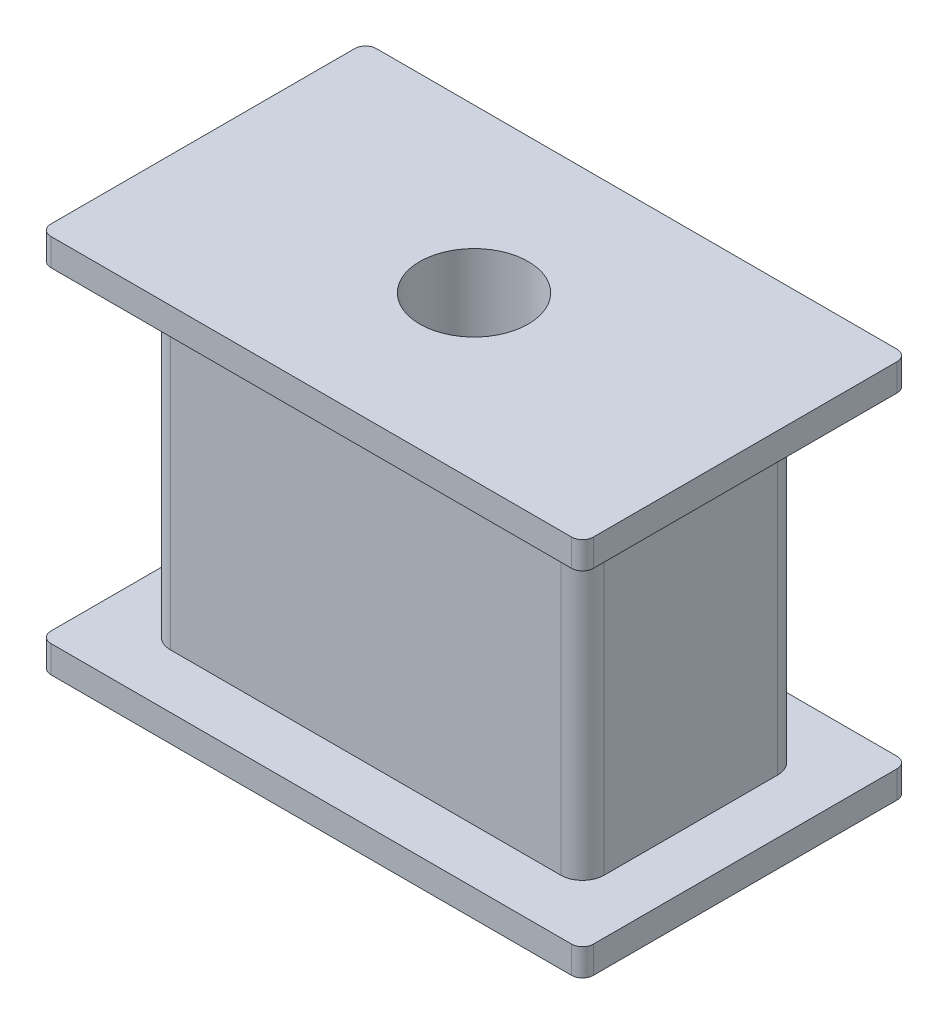
ISO-10303-21;
HEADER;
FILE_DESCRIPTION(('STEP AP214'),'2;1');
FILE_NAME('part.step','',(''),(''),'','','');
FILE_SCHEMA(('AUTOMOTIVE_DESIGN { 1 0 10303 214 1 1 1 1 }'));
ENDSEC;
DATA;
#1=APPLICATION_CONTEXT('core data for automotive mechanical design processes');
#2=APPLICATION_PROTOCOL_DEFINITION('international standard','automotive_design',2000,#1);
#3=PRODUCT_CONTEXT('',#1,'mechanical');
#4=PRODUCT('Part','Part','',(#3));
#5=PRODUCT_RELATED_PRODUCT_CATEGORY('part','',(#4));
#6=PRODUCT_DEFINITION_FORMATION('','',#4);
#7=PRODUCT_DEFINITION_CONTEXT('part definition',#1,'design');
#8=PRODUCT_DEFINITION('design','',#6,#7);
#9=PRODUCT_DEFINITION_SHAPE('','',#8);
#10=(LENGTH_UNIT() NAMED_UNIT(*) SI_UNIT(.MILLI.,.METRE.));
#11=(NAMED_UNIT(*) PLANE_ANGLE_UNIT() SI_UNIT($,.RADIAN.));
#12=(NAMED_UNIT(*) SI_UNIT($,.STERADIAN.) SOLID_ANGLE_UNIT());
#13=UNCERTAINTY_MEASURE_WITH_UNIT(LENGTH_MEASURE(1.E-05),#10,'distance_accuracy_value','');
#14=(GEOMETRIC_REPRESENTATION_CONTEXT(3) GLOBAL_UNCERTAINTY_ASSIGNED_CONTEXT((#13)) GLOBAL_UNIT_ASSIGNED_CONTEXT((#10,
#11,#12)) REPRESENTATION_CONTEXT('',''));
#15=CARTESIAN_POINT('',(0.,0.,0.));
#16=DIRECTION('',(0.,0.,1.));
#17=DIRECTION('',(1.,0.,0.));
#18=AXIS2_PLACEMENT_3D('',#15,#16,#17);
#19=CARTESIAN_POINT('',(20.,30.,10.));
#20=DIRECTION('',(-1.,0.,0.));
#21=DIRECTION('',(0.,0.,1.));
#22=AXIS2_PLACEMENT_3D('',#19,#20,#21);
#23=PLANE('',#22);
#24=DIRECTION('',(0.,0.,-1.));
#25=VECTOR('',#24,1.);
#26=CARTESIAN_POINT('',(20.,30.,10.));
#27=LINE('',#26,#25);
#28=CARTESIAN_POINT('',(20.,30.,8.));
#29=VERTEX_POINT('',#28);
#30=CARTESIAN_POINT('',(20.,30.,-8.));
#31=VERTEX_POINT('',#30);
#32=EDGE_CURVE('E248',#29,#31,#27,.T.);
#33=ORIENTED_EDGE('',*,*,#32,.F.);
#34=DIRECTION('',(0.,-1.,0.));
#35=VECTOR('',#34,1.);
#36=CARTESIAN_POINT('',(20.,30.,8.));
#37=LINE('',#36,#35);
#38=CARTESIAN_POINT('',(20.,0.,8.));
#39=VERTEX_POINT('',#38);
#40=EDGE_CURVE('E231',#29,#39,#37,.T.);
#41=ORIENTED_EDGE('',*,*,#40,.T.);
#42=DIRECTION('',(0.,0.,-1.));
#43=VECTOR('',#42,1.);
#44=CARTESIAN_POINT('',(20.,0.,10.));
#45=LINE('',#44,#43);
#46=CARTESIAN_POINT('',(20.,0.,-8.));
#47=VERTEX_POINT('',#46);
#48=EDGE_CURVE('E377',#39,#47,#45,.T.);
#49=ORIENTED_EDGE('',*,*,#48,.T.);
#50=DIRECTION('',(0.,-1.,0.));
#51=VECTOR('',#50,1.);
#52=CARTESIAN_POINT('',(20.,30.,-8.));
#53=LINE('',#52,#51);
#54=EDGE_CURVE('E267',#47,#31,#53,.F.);
#55=ORIENTED_EDGE('',*,*,#54,.T.);
#56=EDGE_LOOP('',(#33,#41,#49,#55));
#57=FACE_BOUND('',#56,.T.);
#58=ADVANCED_FACE('F59',(#57),#23,.F.);
#59=CARTESIAN_POINT('',(-20.,30.,-10.));
#60=DIRECTION('',(0.,0.,1.));
#61=DIRECTION('',(1.,0.,0.));
#62=AXIS2_PLACEMENT_3D('',#59,#60,#61);
#63=PLANE('',#62);
#64=DIRECTION('',(-1.,0.,0.));
#65=VECTOR('',#64,1.);
#66=CARTESIAN_POINT('',(-20.,0.,-10.));
#67=LINE('',#66,#65);
#68=CARTESIAN_POINT('',(18.,0.,-10.));
#69=VERTEX_POINT('',#68);
#70=CARTESIAN_POINT('',(-18.,0.,-10.));
#71=VERTEX_POINT('',#70);
#72=EDGE_CURVE('E254',#69,#71,#67,.T.);
#73=ORIENTED_EDGE('',*,*,#72,.T.);
#74=DIRECTION('',(0.,-1.,0.));
#75=VECTOR('',#74,1.);
#76=CARTESIAN_POINT('',(-18.,30.,-10.));
#77=LINE('',#76,#75);
#78=CARTESIAN_POINT('',(-18.,30.,-10.));
#79=VERTEX_POINT('',#78);
#80=EDGE_CURVE('E265',#71,#79,#77,.F.);
#81=ORIENTED_EDGE('',*,*,#80,.T.);
#82=DIRECTION('',(-1.,0.,0.));
#83=VECTOR('',#82,1.);
#84=CARTESIAN_POINT('',(-20.,30.,-10.));
#85=LINE('',#84,#83);
#86=CARTESIAN_POINT('',(18.,30.,-10.));
#87=VERTEX_POINT('',#86);
#88=EDGE_CURVE('E252',#87,#79,#85,.T.);
#89=ORIENTED_EDGE('',*,*,#88,.F.);
#90=DIRECTION('',(0.,-1.,0.));
#91=VECTOR('',#90,1.);
#92=CARTESIAN_POINT('',(18.,30.,-10.));
#93=LINE('',#92,#91);
#94=EDGE_CURVE('E262',#87,#69,#93,.T.);
#95=ORIENTED_EDGE('',*,*,#94,.T.);
#96=EDGE_LOOP('',(#73,#81,#89,#95));
#97=FACE_BOUND('',#96,.T.);
#98=ADVANCED_FACE('F384',(#97),#63,.F.);
#99=CARTESIAN_POINT('',(-20.,30.,10.));
#100=DIRECTION('',(1.,0.,0.));
#101=DIRECTION('',(0.,0.,-1.));
#102=AXIS2_PLACEMENT_3D('',#99,#100,#101);
#103=PLANE('',#102);
#104=DIRECTION('',(0.,0.,1.));
#105=VECTOR('',#104,1.);
#106=CARTESIAN_POINT('',(-20.,0.,10.));
#107=LINE('',#106,#105);
#108=CARTESIAN_POINT('',(-20.,0.,-8.));
#109=VERTEX_POINT('',#108);
#110=CARTESIAN_POINT('',(-20.,0.,8.));
#111=VERTEX_POINT('',#110);
#112=EDGE_CURVE('E249',#109,#111,#107,.T.);
#113=ORIENTED_EDGE('',*,*,#112,.T.);
#114=DIRECTION('',(0.,-1.,0.));
#115=VECTOR('',#114,1.);
#116=CARTESIAN_POINT('',(-20.,30.,8.));
#117=LINE('',#116,#115);
#118=CARTESIAN_POINT('',(-20.,30.,8.));
#119=VERTEX_POINT('',#118);
#120=EDGE_CURVE('E225',#111,#119,#117,.F.);
#121=ORIENTED_EDGE('',*,*,#120,.T.);
#122=DIRECTION('',(0.,0.,1.));
#123=VECTOR('',#122,1.);
#124=CARTESIAN_POINT('',(-20.,30.,10.));
#125=LINE('',#124,#123);
#126=CARTESIAN_POINT('',(-20.,30.,-8.));
#127=VERTEX_POINT('',#126);
#128=EDGE_CURVE('E373',#127,#119,#125,.T.);
#129=ORIENTED_EDGE('',*,*,#128,.F.);
#130=DIRECTION('',(0.,-1.,0.));
#131=VECTOR('',#130,1.);
#132=CARTESIAN_POINT('',(-20.,30.,-8.));
#133=LINE('',#132,#131);
#134=EDGE_CURVE('E241',#127,#109,#133,.T.);
#135=ORIENTED_EDGE('',*,*,#134,.T.);
#136=EDGE_LOOP('',(#113,#121,#129,#135));
#137=FACE_BOUND('',#136,.T.);
#138=ADVANCED_FACE('F394',(#137),#103,.F.);
#139=CARTESIAN_POINT('',(-20.,30.,10.));
#140=DIRECTION('',(0.,0.,-1.));
#141=DIRECTION('',(-1.,0.,0.));
#142=AXIS2_PLACEMENT_3D('',#139,#140,#141);
#143=PLANE('',#142);
#144=DIRECTION('',(1.,0.,0.));
#145=VECTOR('',#144,1.);
#146=CARTESIAN_POINT('',(-20.,30.,10.));
#147=LINE('',#146,#145);
#148=CARTESIAN_POINT('',(-18.,30.,10.));
#149=VERTEX_POINT('',#148);
#150=CARTESIAN_POINT('',(18.,30.,10.));
#151=VERTEX_POINT('',#150);
#152=EDGE_CURVE('E240',#149,#151,#147,.T.);
#153=ORIENTED_EDGE('',*,*,#152,.F.);
#154=DIRECTION('',(0.,-1.,0.));
#155=VECTOR('',#154,1.);
#156=CARTESIAN_POINT('',(-18.,30.,10.));
#157=LINE('',#156,#155);
#158=CARTESIAN_POINT('',(-18.,0.,10.));
#159=VERTEX_POINT('',#158);
#160=EDGE_CURVE('E224',#149,#159,#157,.T.);
#161=ORIENTED_EDGE('',*,*,#160,.T.);
#162=DIRECTION('',(1.,0.,0.));
#163=VECTOR('',#162,1.);
#164=CARTESIAN_POINT('',(-20.,0.,10.));
#165=LINE('',#164,#163);
#166=CARTESIAN_POINT('',(18.,0.,10.));
#167=VERTEX_POINT('',#166);
#168=EDGE_CURVE('E237',#159,#167,#165,.T.);
#169=ORIENTED_EDGE('',*,*,#168,.T.);
#170=DIRECTION('',(0.,-1.,0.));
#171=VECTOR('',#170,1.);
#172=CARTESIAN_POINT('',(18.,30.,10.));
#173=LINE('',#172,#171);
#174=EDGE_CURVE('E242',#167,#151,#173,.F.);
#175=ORIENTED_EDGE('',*,*,#174,.T.);
#176=EDGE_LOOP('',(#153,#161,#169,#175));
#177=FACE_BOUND('',#176,.T.);
#178=ADVANCED_FACE('F236',(#177),#143,.F.);
#179=CARTESIAN_POINT('',(25.,32.5,15.));
#180=DIRECTION('',(-1.,0.,0.));
#181=DIRECTION('',(0.,0.,1.));
#182=AXIS2_PLACEMENT_3D('',#179,#180,#181);
#183=PLANE('',#182);
#184=DIRECTION('',(0.,0.,-1.));
#185=VECTOR('',#184,1.);
#186=CARTESIAN_POINT('',(25.,32.5,15.));
#187=LINE('',#186,#185);
#188=CARTESIAN_POINT('',(25.,32.5,14.));
#189=VERTEX_POINT('',#188);
#190=CARTESIAN_POINT('',(25.,32.5,-14.));
#191=VERTEX_POINT('',#190);
#192=EDGE_CURVE('E365',#189,#191,#187,.T.);
#193=ORIENTED_EDGE('',*,*,#192,.F.);
#194=DIRECTION('',(0.,-1.,0.));
#195=VECTOR('',#194,1.);
#196=CARTESIAN_POINT('',(25.,32.5,14.));
#197=LINE('',#196,#195);
#198=CARTESIAN_POINT('',(25.,30.,14.));
#199=VERTEX_POINT('',#198);
#200=EDGE_CURVE('E321',#189,#199,#197,.T.);
#201=ORIENTED_EDGE('',*,*,#200,.T.);
#202=DIRECTION('',(0.,0.,-1.));
#203=VECTOR('',#202,1.);
#204=CARTESIAN_POINT('',(25.,30.,15.));
#205=LINE('',#204,#203);
#206=CARTESIAN_POINT('',(25.,30.,-14.));
#207=VERTEX_POINT('',#206);
#208=EDGE_CURVE('E367',#199,#207,#205,.T.);
#209=ORIENTED_EDGE('',*,*,#208,.T.);
#210=DIRECTION('',(0.,-1.,0.));
#211=VECTOR('',#210,1.);
#212=CARTESIAN_POINT('',(25.,32.5,-14.));
#213=LINE('',#212,#211);
#214=EDGE_CURVE('E319',#207,#191,#213,.F.);
#215=ORIENTED_EDGE('',*,*,#214,.T.);
#216=EDGE_LOOP('',(#193,#201,#209,#215));
#217=FACE_BOUND('',#216,.T.);
#218=ADVANCED_FACE('F401',(#217),#183,.F.);
#219=CARTESIAN_POINT('',(-25.,32.5,-15.));
#220=DIRECTION('',(0.,0.,1.));
#221=DIRECTION('',(1.,0.,0.));
#222=AXIS2_PLACEMENT_3D('',#219,#220,#221);
#223=PLANE('',#222);
#224=DIRECTION('',(-1.,0.,0.));
#225=VECTOR('',#224,1.);
#226=CARTESIAN_POINT('',(-25.,32.5,-15.));
#227=LINE('',#226,#225);
#228=CARTESIAN_POINT('',(24.,32.5,-15.));
#229=VERTEX_POINT('',#228);
#230=CARTESIAN_POINT('',(-24.,32.5,-15.));
#231=VERTEX_POINT('',#230);
#232=EDGE_CURVE('E463',#229,#231,#227,.T.);
#233=ORIENTED_EDGE('',*,*,#232,.F.);
#234=DIRECTION('',(0.,-1.,0.));
#235=VECTOR('',#234,1.);
#236=CARTESIAN_POINT('',(24.,32.5,-15.));
#237=LINE('',#236,#235);
#238=CARTESIAN_POINT('',(24.,30.,-15.));
#239=VERTEX_POINT('',#238);
#240=EDGE_CURVE('E346',#229,#239,#237,.T.);
#241=ORIENTED_EDGE('',*,*,#240,.T.);
#242=DIRECTION('',(-1.,0.,0.));
#243=VECTOR('',#242,1.);
#244=CARTESIAN_POINT('',(-25.,30.,-15.));
#245=LINE('',#244,#243);
#246=CARTESIAN_POINT('',(-24.,30.,-15.));
#247=VERTEX_POINT('',#246);
#248=EDGE_CURVE('E362',#239,#247,#245,.T.);
#249=ORIENTED_EDGE('',*,*,#248,.T.);
#250=DIRECTION('',(0.,-1.,0.));
#251=VECTOR('',#250,1.);
#252=CARTESIAN_POINT('',(-24.,32.5,-15.));
#253=LINE('',#252,#251);
#254=EDGE_CURVE('E344',#247,#231,#253,.F.);
#255=ORIENTED_EDGE('',*,*,#254,.T.);
#256=EDGE_LOOP('',(#233,#241,#249,#255));
#257=FACE_BOUND('',#256,.T.);
#258=ADVANCED_FACE('F501',(#257),#223,.F.);
#259=CARTESIAN_POINT('',(-25.,32.5,15.));
#260=DIRECTION('',(1.,0.,0.));
#261=DIRECTION('',(0.,0.,-1.));
#262=AXIS2_PLACEMENT_3D('',#259,#260,#261);
#263=PLANE('',#262);
#264=DIRECTION('',(0.,0.,1.));
#265=VECTOR('',#264,1.);
#266=CARTESIAN_POINT('',(-25.,30.,15.));
#267=LINE('',#266,#265);
#268=CARTESIAN_POINT('',(-25.,30.,-14.));
#269=VERTEX_POINT('',#268);
#270=CARTESIAN_POINT('',(-25.,30.,14.));
#271=VERTEX_POINT('',#270);
#272=EDGE_CURVE('E352',#269,#271,#267,.T.);
#273=ORIENTED_EDGE('',*,*,#272,.T.);
#274=DIRECTION('',(0.,-1.,0.));
#275=VECTOR('',#274,1.);
#276=CARTESIAN_POINT('',(-25.,32.5,14.));
#277=LINE('',#276,#275);
#278=CARTESIAN_POINT('',(-25.,32.5,14.));
#279=VERTEX_POINT('',#278);
#280=EDGE_CURVE('E12',#271,#279,#277,.F.);
#281=ORIENTED_EDGE('',*,*,#280,.T.);
#282=DIRECTION('',(0.,0.,1.));
#283=VECTOR('',#282,1.);
#284=CARTESIAN_POINT('',(-25.,32.5,15.));
#285=LINE('',#284,#283);
#286=CARTESIAN_POINT('',(-25.,32.5,-14.));
#287=VERTEX_POINT('',#286);
#288=EDGE_CURVE('E353',#287,#279,#285,.T.);
#289=ORIENTED_EDGE('',*,*,#288,.F.);
#290=DIRECTION('',(0.,-1.,0.));
#291=VECTOR('',#290,1.);
#292=CARTESIAN_POINT('',(-25.,32.5,-14.));
#293=LINE('',#292,#291);
#294=EDGE_CURVE('E67',#287,#269,#293,.T.);
#295=ORIENTED_EDGE('',*,*,#294,.T.);
#296=EDGE_LOOP('',(#273,#281,#289,#295));
#297=FACE_BOUND('',#296,.T.);
#298=ADVANCED_FACE('F351',(#297),#263,.F.);
#299=CARTESIAN_POINT('',(-25.,32.5,15.));
#300=DIRECTION('',(0.,0.,-1.));
#301=DIRECTION('',(-1.,0.,0.));
#302=AXIS2_PLACEMENT_3D('',#299,#300,#301);
#303=PLANE('',#302);
#304=DIRECTION('',(1.,0.,0.));
#305=VECTOR('',#304,1.);
#306=CARTESIAN_POINT('',(-25.,30.,15.));
#307=LINE('',#306,#305);
#308=CARTESIAN_POINT('',(-24.,30.,15.));
#309=VERTEX_POINT('',#308);
#310=CARTESIAN_POINT('',(24.,30.,15.));
#311=VERTEX_POINT('',#310);
#312=EDGE_CURVE('E361',#309,#311,#307,.T.);
#313=ORIENTED_EDGE('',*,*,#312,.T.);
#314=DIRECTION('',(0.,-1.,0.));
#315=VECTOR('',#314,1.);
#316=CARTESIAN_POINT('',(24.,32.5,15.));
#317=LINE('',#316,#315);
#318=CARTESIAN_POINT('',(24.,32.5,15.));
#319=VERTEX_POINT('',#318);
#320=EDGE_CURVE('E335',#311,#319,#317,.F.);
#321=ORIENTED_EDGE('',*,*,#320,.T.);
#322=DIRECTION('',(1.,0.,0.));
#323=VECTOR('',#322,1.);
#324=CARTESIAN_POINT('',(-25.,32.5,15.));
#325=LINE('',#324,#323);
#326=CARTESIAN_POINT('',(-24.,32.5,15.));
#327=VERTEX_POINT('',#326);
#328=EDGE_CURVE('E379',#327,#319,#325,.T.);
#329=ORIENTED_EDGE('',*,*,#328,.F.);
#330=DIRECTION('',(0.,-1.,0.));
#331=VECTOR('',#330,1.);
#332=CARTESIAN_POINT('',(-24.,32.5,15.));
#333=LINE('',#332,#331);
#334=EDGE_CURVE('E332',#327,#309,#333,.T.);
#335=ORIENTED_EDGE('',*,*,#334,.T.);
#336=EDGE_LOOP('',(#313,#321,#329,#335));
#337=FACE_BOUND('',#336,.T.);
#338=ADVANCED_FACE('F460',(#337),#303,.F.);
#339=CARTESIAN_POINT('',(0.,32.5,0.));
#340=DIRECTION('',(0.,-1.,0.));
#341=DIRECTION('',(0.,0.,-1.));
#342=AXIS2_PLACEMENT_3D('',#339,#340,#341);
#343=PLANE('',#342);
#344=CARTESIAN_POINT('',(0.,32.5,0.));
#345=DIRECTION('',(0.,1.,0.));
#346=DIRECTION('',(0.,0.,1.));
#347=AXIS2_PLACEMENT_3D('',#344,#345,#346);
#348=CIRCLE('',#347,5.);
#349=CARTESIAN_POINT('',(0.,32.5,5.));
#350=VERTEX_POINT('',#349);
#351=EDGE_CURVE('E550',#350,#350,#348,.T.);
#352=ORIENTED_EDGE('',*,*,#351,.F.);
#353=EDGE_LOOP('',(#352));
#354=FACE_BOUND('',#353,.T.);
#355=ORIENTED_EDGE('',*,*,#328,.T.);
#356=CARTESIAN_POINT('',(24.,32.5,14.));
#357=DIRECTION('',(0.,-1.,0.));
#358=DIRECTION('',(0.,0.,-1.));
#359=AXIS2_PLACEMENT_3D('',#356,#357,#358);
#360=CIRCLE('',#359,1.);
#361=EDGE_CURVE('E342',#319,#189,#360,.F.);
#362=ORIENTED_EDGE('',*,*,#361,.T.);
#363=ORIENTED_EDGE('',*,*,#192,.T.);
#364=CARTESIAN_POINT('',(24.,32.5,-14.));
#365=DIRECTION('',(0.,-1.,0.));
#366=DIRECTION('',(0.,0.,-1.));
#367=AXIS2_PLACEMENT_3D('',#364,#365,#366);
#368=CIRCLE('',#367,1.);
#369=EDGE_CURVE('E340',#191,#229,#368,.F.);
#370=ORIENTED_EDGE('',*,*,#369,.T.);
#371=ORIENTED_EDGE('',*,*,#232,.T.);
#372=CARTESIAN_POINT('',(-24.,32.5,-14.));
#373=DIRECTION('',(0.,-1.,0.));
#374=DIRECTION('',(0.,0.,-1.));
#375=AXIS2_PLACEMENT_3D('',#372,#373,#374);
#376=CIRCLE('',#375,1.);
#377=EDGE_CURVE('E79',#231,#287,#376,.F.);
#378=ORIENTED_EDGE('',*,*,#377,.T.);
#379=ORIENTED_EDGE('',*,*,#288,.T.);
#380=CARTESIAN_POINT('',(-24.,32.5,14.));
#381=DIRECTION('',(0.,-1.,0.));
#382=DIRECTION('',(0.,0.,-1.));
#383=AXIS2_PLACEMENT_3D('',#380,#381,#382);
#384=CIRCLE('',#383,1.);
#385=EDGE_CURVE('E338',#279,#327,#384,.F.);
#386=ORIENTED_EDGE('',*,*,#385,.T.);
#387=EDGE_LOOP('',(#355,#362,#363,#370,#371,#378,#379,#386));
#388=FACE_BOUND('',#387,.T.);
#389=ADVANCED_FACE('F457',(#354,#388),#343,.F.);
#390=CARTESIAN_POINT('',(0.,30.,0.));
#391=DIRECTION('',(0.,-1.,0.));
#392=DIRECTION('',(0.,0.,-1.));
#393=AXIS2_PLACEMENT_3D('',#390,#391,#392);
#394=PLANE('',#393);
#395=ORIENTED_EDGE('',*,*,#128,.T.);
#396=CARTESIAN_POINT('',(-18.,30.,8.));
#397=DIRECTION('',(0.,-1.,0.));
#398=DIRECTION('',(0.,0.,-1.));
#399=AXIS2_PLACEMENT_3D('',#396,#397,#398);
#400=CIRCLE('',#399,2.);
#401=EDGE_CURVE('E230',#119,#149,#400,.F.);
#402=ORIENTED_EDGE('',*,*,#401,.T.);
#403=ORIENTED_EDGE('',*,*,#152,.T.);
#404=CARTESIAN_POINT('',(18.,30.,8.));
#405=DIRECTION('',(0.,-1.,0.));
#406=DIRECTION('',(0.,0.,-1.));
#407=AXIS2_PLACEMENT_3D('',#404,#405,#406);
#408=CIRCLE('',#407,2.);
#409=EDGE_CURVE('E277',#151,#29,#408,.F.);
#410=ORIENTED_EDGE('',*,*,#409,.T.);
#411=ORIENTED_EDGE('',*,*,#32,.T.);
#412=CARTESIAN_POINT('',(18.,30.,-8.));
#413=DIRECTION('',(0.,-1.,0.));
#414=DIRECTION('',(0.,0.,-1.));
#415=AXIS2_PLACEMENT_3D('',#412,#413,#414);
#416=CIRCLE('',#415,2.);
#417=EDGE_CURVE('E281',#31,#87,#416,.F.);
#418=ORIENTED_EDGE('',*,*,#417,.T.);
#419=ORIENTED_EDGE('',*,*,#88,.T.);
#420=CARTESIAN_POINT('',(-18.,30.,-8.));
#421=DIRECTION('',(0.,-1.,0.));
#422=DIRECTION('',(0.,0.,-1.));
#423=AXIS2_PLACEMENT_3D('',#420,#421,#422);
#424=CIRCLE('',#423,2.);
#425=EDGE_CURVE('E274',#79,#127,#424,.F.);
#426=ORIENTED_EDGE('',*,*,#425,.T.);
#427=EDGE_LOOP('',(#395,#402,#403,#410,#411,#418,#419,#426));
#428=FACE_BOUND('',#427,.T.);
#429=ORIENTED_EDGE('',*,*,#208,.F.);
#430=CARTESIAN_POINT('',(24.,30.,14.));
#431=DIRECTION('',(0.,-1.,0.));
#432=DIRECTION('',(0.,0.,-1.));
#433=AXIS2_PLACEMENT_3D('',#430,#431,#432);
#434=CIRCLE('',#433,1.);
#435=EDGE_CURVE('E330',#199,#311,#434,.T.);
#436=ORIENTED_EDGE('',*,*,#435,.T.);
#437=ORIENTED_EDGE('',*,*,#312,.F.);
#438=CARTESIAN_POINT('',(-24.,30.,14.));
#439=DIRECTION('',(0.,-1.,0.));
#440=DIRECTION('',(0.,0.,-1.));
#441=AXIS2_PLACEMENT_3D('',#438,#439,#440);
#442=CIRCLE('',#441,1.);
#443=EDGE_CURVE('E326',#309,#271,#442,.T.);
#444=ORIENTED_EDGE('',*,*,#443,.T.);
#445=ORIENTED_EDGE('',*,*,#272,.F.);
#446=CARTESIAN_POINT('',(-24.,30.,-14.));
#447=DIRECTION('',(0.,-1.,0.));
#448=DIRECTION('',(0.,0.,-1.));
#449=AXIS2_PLACEMENT_3D('',#446,#447,#448);
#450=CIRCLE('',#449,1.);
#451=EDGE_CURVE('E324',#269,#247,#450,.T.);
#452=ORIENTED_EDGE('',*,*,#451,.T.);
#453=ORIENTED_EDGE('',*,*,#248,.F.);
#454=CARTESIAN_POINT('',(24.,30.,-14.));
#455=DIRECTION('',(0.,-1.,0.));
#456=DIRECTION('',(0.,0.,-1.));
#457=AXIS2_PLACEMENT_3D('',#454,#455,#456);
#458=CIRCLE('',#457,1.);
#459=EDGE_CURVE('E328',#239,#207,#458,.T.);
#460=ORIENTED_EDGE('',*,*,#459,.T.);
#461=EDGE_LOOP('',(#429,#436,#437,#444,#445,#452,#453,#460));
#462=FACE_BOUND('',#461,.T.);
#463=ADVANCED_FACE('F357',(#428,#462),#394,.T.);
#464=CARTESIAN_POINT('',(0.,-2.5,15.));
#465=DIRECTION('',(0.,0.,1.));
#466=DIRECTION('',(1.,0.,0.));
#467=AXIS2_PLACEMENT_3D('',#464,#465,#466);
#468=PLANE('',#467);
#469=DIRECTION('',(1.,0.,0.));
#470=VECTOR('',#469,1.);
#471=CARTESIAN_POINT('',(0.,-2.5,15.));
#472=LINE('',#471,#470);
#473=CARTESIAN_POINT('',(-24.,-2.5,15.));
#474=VERTEX_POINT('',#473);
#475=CARTESIAN_POINT('',(24.,-2.5,15.));
#476=VERTEX_POINT('',#475);
#477=EDGE_CURVE('E477',#474,#476,#472,.T.);
#478=ORIENTED_EDGE('',*,*,#477,.T.);
#479=DIRECTION('',(0.,1.,0.));
#480=VECTOR('',#479,1.);
#481=CARTESIAN_POINT('',(24.,-2.5,15.));
#482=LINE('',#481,#480);
#483=CARTESIAN_POINT('',(24.,0.,15.));
#484=VERTEX_POINT('',#483);
#485=EDGE_CURVE('E285',#476,#484,#482,.T.);
#486=ORIENTED_EDGE('',*,*,#485,.T.);
#487=DIRECTION('',(1.,0.,0.));
#488=VECTOR('',#487,1.);
#489=CARTESIAN_POINT('',(0.,0.,15.));
#490=LINE('',#489,#488);
#491=CARTESIAN_POINT('',(-24.,0.,15.));
#492=VERTEX_POINT('',#491);
#493=EDGE_CURVE('E484',#492,#484,#490,.T.);
#494=ORIENTED_EDGE('',*,*,#493,.F.);
#495=DIRECTION('',(0.,1.,0.));
#496=VECTOR('',#495,1.);
#497=CARTESIAN_POINT('',(-24.,-2.5,15.));
#498=LINE('',#497,#496);
#499=EDGE_CURVE('E283',#492,#474,#498,.F.);
#500=ORIENTED_EDGE('',*,*,#499,.T.);
#501=EDGE_LOOP('',(#478,#486,#494,#500));
#502=FACE_BOUND('',#501,.T.);
#503=ADVANCED_FACE('F517',(#502),#468,.T.);
#504=CARTESIAN_POINT('',(-25.,-2.5,0.));
#505=DIRECTION('',(-1.,0.,0.));
#506=DIRECTION('',(0.,0.,1.));
#507=AXIS2_PLACEMENT_3D('',#504,#505,#506);
#508=PLANE('',#507);
#509=DIRECTION('',(0.,0.,1.));
#510=VECTOR('',#509,1.);
#511=CARTESIAN_POINT('',(-25.,-2.5,0.));
#512=LINE('',#511,#510);
#513=CARTESIAN_POINT('',(-25.,-2.5,-14.));
#514=VERTEX_POINT('',#513);
#515=CARTESIAN_POINT('',(-25.,-2.5,14.));
#516=VERTEX_POINT('',#515);
#517=EDGE_CURVE('E471',#514,#516,#512,.T.);
#518=ORIENTED_EDGE('',*,*,#517,.T.);
#519=DIRECTION('',(0.,1.,0.));
#520=VECTOR('',#519,1.);
#521=CARTESIAN_POINT('',(-25.,-2.5,14.));
#522=LINE('',#521,#520);
#523=CARTESIAN_POINT('',(-25.,0.,14.));
#524=VERTEX_POINT('',#523);
#525=EDGE_CURVE('E311',#516,#524,#522,.T.);
#526=ORIENTED_EDGE('',*,*,#525,.T.);
#527=DIRECTION('',(0.,0.,1.));
#528=VECTOR('',#527,1.);
#529=CARTESIAN_POINT('',(-25.,0.,0.));
#530=LINE('',#529,#528);
#531=CARTESIAN_POINT('',(-25.,0.,-14.));
#532=VERTEX_POINT('',#531);
#533=EDGE_CURVE('E488',#532,#524,#530,.T.);
#534=ORIENTED_EDGE('',*,*,#533,.F.);
#535=DIRECTION('',(0.,1.,0.));
#536=VECTOR('',#535,1.);
#537=CARTESIAN_POINT('',(-25.,-2.5,-14.));
#538=LINE('',#537,#536);
#539=EDGE_CURVE('E309',#532,#514,#538,.F.);
#540=ORIENTED_EDGE('',*,*,#539,.T.);
#541=EDGE_LOOP('',(#518,#526,#534,#540));
#542=FACE_BOUND('',#541,.T.);
#543=ADVANCED_FACE('F528',(#542),#508,.T.);
#544=CARTESIAN_POINT('',(0.,-2.5,-15.));
#545=DIRECTION('',(0.,0.,-1.));
#546=DIRECTION('',(-1.,0.,0.));
#547=AXIS2_PLACEMENT_3D('',#544,#545,#546);
#548=PLANE('',#547);
#549=DIRECTION('',(-1.,0.,0.));
#550=VECTOR('',#549,1.);
#551=CARTESIAN_POINT('',(0.,-2.5,-15.));
#552=LINE('',#551,#550);
#553=CARTESIAN_POINT('',(24.,-2.5,-15.));
#554=VERTEX_POINT('',#553);
#555=CARTESIAN_POINT('',(-24.,-2.5,-15.));
#556=VERTEX_POINT('',#555);
#557=EDGE_CURVE('E467',#554,#556,#552,.T.);
#558=ORIENTED_EDGE('',*,*,#557,.T.);
#559=DIRECTION('',(0.,1.,0.));
#560=VECTOR('',#559,1.);
#561=CARTESIAN_POINT('',(-24.,-2.5,-15.));
#562=LINE('',#561,#560);
#563=CARTESIAN_POINT('',(-24.,0.,-15.));
#564=VERTEX_POINT('',#563);
#565=EDGE_CURVE('E316',#556,#564,#562,.T.);
#566=ORIENTED_EDGE('',*,*,#565,.T.);
#567=DIRECTION('',(-1.,0.,0.));
#568=VECTOR('',#567,1.);
#569=CARTESIAN_POINT('',(0.,0.,-15.));
#570=LINE('',#569,#568);
#571=CARTESIAN_POINT('',(24.,0.,-15.));
#572=VERTEX_POINT('',#571);
#573=EDGE_CURVE('E491',#572,#564,#570,.T.);
#574=ORIENTED_EDGE('',*,*,#573,.F.);
#575=DIRECTION('',(0.,1.,0.));
#576=VECTOR('',#575,1.);
#577=CARTESIAN_POINT('',(24.,-2.5,-15.));
#578=LINE('',#577,#576);
#579=EDGE_CURVE('E314',#572,#554,#578,.F.);
#580=ORIENTED_EDGE('',*,*,#579,.T.);
#581=EDGE_LOOP('',(#558,#566,#574,#580));
#582=FACE_BOUND('',#581,.T.);
#583=ADVANCED_FACE('F524',(#582),#548,.T.);
#584=CARTESIAN_POINT('',(25.,-2.5,0.));
#585=DIRECTION('',(1.,0.,0.));
#586=DIRECTION('',(0.,0.,-1.));
#587=AXIS2_PLACEMENT_3D('',#584,#585,#586);
#588=PLANE('',#587);
#589=DIRECTION('',(0.,0.,-1.));
#590=VECTOR('',#589,1.);
#591=CARTESIAN_POINT('',(25.,0.,0.));
#592=LINE('',#591,#590);
#593=CARTESIAN_POINT('',(25.,0.,14.));
#594=VERTEX_POINT('',#593);
#595=CARTESIAN_POINT('',(25.,0.,-14.));
#596=VERTEX_POINT('',#595);
#597=EDGE_CURVE('E481',#594,#596,#592,.T.);
#598=ORIENTED_EDGE('',*,*,#597,.F.);
#599=DIRECTION('',(0.,1.,0.));
#600=VECTOR('',#599,1.);
#601=CARTESIAN_POINT('',(25.,-2.5,14.));
#602=LINE('',#601,#600);
#603=CARTESIAN_POINT('',(25.,-2.5,14.));
#604=VERTEX_POINT('',#603);
#605=EDGE_CURVE('E299',#594,#604,#602,.F.);
#606=ORIENTED_EDGE('',*,*,#605,.T.);
#607=DIRECTION('',(0.,0.,-1.));
#608=VECTOR('',#607,1.);
#609=CARTESIAN_POINT('',(25.,-2.5,0.));
#610=LINE('',#609,#608);
#611=CARTESIAN_POINT('',(25.,-2.5,-14.));
#612=VERTEX_POINT('',#611);
#613=EDGE_CURVE('E494',#604,#612,#610,.T.);
#614=ORIENTED_EDGE('',*,*,#613,.T.);
#615=DIRECTION('',(0.,1.,0.));
#616=VECTOR('',#615,1.);
#617=CARTESIAN_POINT('',(25.,-2.5,-14.));
#618=LINE('',#617,#616);
#619=EDGE_CURVE('E296',#612,#596,#618,.T.);
#620=ORIENTED_EDGE('',*,*,#619,.T.);
#621=EDGE_LOOP('',(#598,#606,#614,#620));
#622=FACE_BOUND('',#621,.T.);
#623=ADVANCED_FACE('F521',(#622),#588,.T.);
#624=CARTESIAN_POINT('',(0.,0.,0.));
#625=DIRECTION('',(0.,-1.,0.));
#626=DIRECTION('',(0.,0.,-1.));
#627=AXIS2_PLACEMENT_3D('',#624,#625,#626);
#628=PLANE('',#627);
#629=ORIENTED_EDGE('',*,*,#48,.F.);
#630=CARTESIAN_POINT('',(18.,0.,8.));
#631=DIRECTION('',(0.,-1.,0.));
#632=DIRECTION('',(0.,0.,-1.));
#633=AXIS2_PLACEMENT_3D('',#630,#631,#632);
#634=CIRCLE('',#633,2.);
#635=EDGE_CURVE('E247',#39,#167,#634,.T.);
#636=ORIENTED_EDGE('',*,*,#635,.T.);
#637=ORIENTED_EDGE('',*,*,#168,.F.);
#638=CARTESIAN_POINT('',(-18.,0.,8.));
#639=DIRECTION('',(0.,-1.,0.));
#640=DIRECTION('',(0.,0.,-1.));
#641=AXIS2_PLACEMENT_3D('',#638,#639,#640);
#642=CIRCLE('',#641,2.);
#643=EDGE_CURVE('E220',#159,#111,#642,.T.);
#644=ORIENTED_EDGE('',*,*,#643,.T.);
#645=ORIENTED_EDGE('',*,*,#112,.F.);
#646=CARTESIAN_POINT('',(-18.,0.,-8.));
#647=DIRECTION('',(0.,-1.,0.));
#648=DIRECTION('',(0.,0.,-1.));
#649=AXIS2_PLACEMENT_3D('',#646,#647,#648);
#650=CIRCLE('',#649,2.);
#651=EDGE_CURVE('E272',#109,#71,#650,.T.);
#652=ORIENTED_EDGE('',*,*,#651,.T.);
#653=ORIENTED_EDGE('',*,*,#72,.F.);
#654=CARTESIAN_POINT('',(18.,0.,-8.));
#655=DIRECTION('',(0.,-1.,0.));
#656=DIRECTION('',(0.,0.,-1.));
#657=AXIS2_PLACEMENT_3D('',#654,#655,#656);
#658=CIRCLE('',#657,2.);
#659=EDGE_CURVE('E279',#69,#47,#658,.T.);
#660=ORIENTED_EDGE('',*,*,#659,.T.);
#661=EDGE_LOOP('',(#629,#636,#637,#644,#645,#652,#653,#660));
#662=FACE_BOUND('',#661,.T.);
#663=ORIENTED_EDGE('',*,*,#493,.T.);
#664=CARTESIAN_POINT('',(24.,0.,14.));
#665=DIRECTION('',(0.,-1.,0.));
#666=DIRECTION('',(0.,0.,-1.));
#667=AXIS2_PLACEMENT_3D('',#664,#665,#666);
#668=CIRCLE('',#667,1.);
#669=EDGE_CURVE('E294',#484,#594,#668,.F.);
#670=ORIENTED_EDGE('',*,*,#669,.T.);
#671=ORIENTED_EDGE('',*,*,#597,.T.);
#672=CARTESIAN_POINT('',(24.,0.,-14.));
#673=DIRECTION('',(0.,-1.,0.));
#674=DIRECTION('',(0.,0.,-1.));
#675=AXIS2_PLACEMENT_3D('',#672,#673,#674);
#676=CIRCLE('',#675,1.);
#677=EDGE_CURVE('E288',#596,#572,#676,.F.);
#678=ORIENTED_EDGE('',*,*,#677,.T.);
#679=ORIENTED_EDGE('',*,*,#573,.T.);
#680=CARTESIAN_POINT('',(-24.,0.,-14.));
#681=DIRECTION('',(0.,-1.,0.));
#682=DIRECTION('',(0.,0.,-1.));
#683=AXIS2_PLACEMENT_3D('',#680,#681,#682);
#684=CIRCLE('',#683,1.);
#685=EDGE_CURVE('E290',#564,#532,#684,.F.);
#686=ORIENTED_EDGE('',*,*,#685,.T.);
#687=ORIENTED_EDGE('',*,*,#533,.T.);
#688=CARTESIAN_POINT('',(-24.,0.,14.));
#689=DIRECTION('',(0.,-1.,0.));
#690=DIRECTION('',(0.,0.,-1.));
#691=AXIS2_PLACEMENT_3D('',#688,#689,#690);
#692=CIRCLE('',#691,1.);
#693=EDGE_CURVE('E292',#524,#492,#692,.F.);
#694=ORIENTED_EDGE('',*,*,#693,.T.);
#695=EDGE_LOOP('',(#663,#670,#671,#678,#679,#686,#687,#694));
#696=FACE_BOUND('',#695,.T.);
#697=ADVANCED_FACE('F245',(#662,#696),#628,.F.);
#698=CARTESIAN_POINT('',(0.,-2.5,0.));
#699=DIRECTION('',(0.,-1.,0.));
#700=DIRECTION('',(0.,0.,-1.));
#701=AXIS2_PLACEMENT_3D('',#698,#699,#700);
#702=PLANE('',#701);
#703=CARTESIAN_POINT('',(0.,-2.5,0.));
#704=DIRECTION('',(0.,1.,0.));
#705=DIRECTION('',(0.,0.,1.));
#706=AXIS2_PLACEMENT_3D('',#703,#704,#705);
#707=CIRCLE('',#706,5.);
#708=CARTESIAN_POINT('',(0.,-2.5,5.));
#709=VERTEX_POINT('',#708);
#710=EDGE_CURVE('E485',#709,#709,#707,.T.);
#711=ORIENTED_EDGE('',*,*,#710,.T.);
#712=EDGE_LOOP('',(#711));
#713=FACE_BOUND('',#712,.T.);
#714=ORIENTED_EDGE('',*,*,#613,.F.);
#715=CARTESIAN_POINT('',(24.,-2.5,14.));
#716=DIRECTION('',(0.,-1.,0.));
#717=DIRECTION('',(0.,0.,-1.));
#718=AXIS2_PLACEMENT_3D('',#715,#716,#717);
#719=CIRCLE('',#718,1.);
#720=EDGE_CURVE('E307',#604,#476,#719,.T.);
#721=ORIENTED_EDGE('',*,*,#720,.T.);
#722=ORIENTED_EDGE('',*,*,#477,.F.);
#723=CARTESIAN_POINT('',(-24.,-2.5,14.));
#724=DIRECTION('',(0.,-1.,0.));
#725=DIRECTION('',(0.,0.,-1.));
#726=AXIS2_PLACEMENT_3D('',#723,#724,#725);
#727=CIRCLE('',#726,1.);
#728=EDGE_CURVE('E305',#474,#516,#727,.T.);
#729=ORIENTED_EDGE('',*,*,#728,.T.);
#730=ORIENTED_EDGE('',*,*,#517,.F.);
#731=CARTESIAN_POINT('',(-24.,-2.5,-14.));
#732=DIRECTION('',(0.,-1.,0.));
#733=DIRECTION('',(0.,0.,-1.));
#734=AXIS2_PLACEMENT_3D('',#731,#732,#733);
#735=CIRCLE('',#734,1.);
#736=EDGE_CURVE('E303',#514,#556,#735,.T.);
#737=ORIENTED_EDGE('',*,*,#736,.T.);
#738=ORIENTED_EDGE('',*,*,#557,.F.);
#739=CARTESIAN_POINT('',(24.,-2.5,-14.));
#740=DIRECTION('',(0.,-1.,0.));
#741=DIRECTION('',(0.,0.,-1.));
#742=AXIS2_PLACEMENT_3D('',#739,#740,#741);
#743=CIRCLE('',#742,1.);
#744=EDGE_CURVE('E301',#554,#612,#743,.T.);
#745=ORIENTED_EDGE('',*,*,#744,.T.);
#746=EDGE_LOOP('',(#714,#721,#722,#729,#730,#737,#738,#745));
#747=FACE_BOUND('',#746,.T.);
#748=ADVANCED_FACE('F537',(#713,#747),#702,.T.);
#749=CARTESIAN_POINT('',(0.,-2.5,0.));
#750=DIRECTION('',(0.,1.,0.));
#751=DIRECTION('',(0.,0.,1.));
#752=AXIS2_PLACEMENT_3D('',#749,#750,#751);
#753=CYLINDRICAL_SURFACE('',#752,5.);
#754=ORIENTED_EDGE('',*,*,#710,.F.);
#755=EDGE_LOOP('',(#754));
#756=FACE_BOUND('',#755,.T.);
#757=ORIENTED_EDGE('',*,*,#351,.T.);
#758=EDGE_LOOP('',(#757));
#759=FACE_BOUND('',#758,.T.);
#760=ADVANCED_FACE('F413',(#756,#759),#753,.F.);
#761=CARTESIAN_POINT('',(-18.,30.,8.));
#762=DIRECTION('',(0.,-1.,0.));
#763=DIRECTION('',(0.,0.,-1.));
#764=AXIS2_PLACEMENT_3D('',#761,#762,#763);
#765=CYLINDRICAL_SURFACE('',#764,2.);
#766=ORIENTED_EDGE('',*,*,#401,.F.);
#767=ORIENTED_EDGE('',*,*,#120,.F.);
#768=ORIENTED_EDGE('',*,*,#643,.F.);
#769=ORIENTED_EDGE('',*,*,#160,.F.);
#770=EDGE_LOOP('',(#766,#767,#768,#769));
#771=FACE_BOUND('',#770,.T.);
#772=ADVANCED_FACE('F223',(#771),#765,.T.);
#773=CARTESIAN_POINT('',(-18.,30.,-8.));
#774=DIRECTION('',(0.,-1.,0.));
#775=DIRECTION('',(0.,0.,-1.));
#776=AXIS2_PLACEMENT_3D('',#773,#774,#775);
#777=CYLINDRICAL_SURFACE('',#776,2.);
#778=ORIENTED_EDGE('',*,*,#425,.F.);
#779=ORIENTED_EDGE('',*,*,#80,.F.);
#780=ORIENTED_EDGE('',*,*,#651,.F.);
#781=ORIENTED_EDGE('',*,*,#134,.F.);
#782=EDGE_LOOP('',(#778,#779,#780,#781));
#783=FACE_BOUND('',#782,.T.);
#784=ADVANCED_FACE('F389',(#783),#777,.T.);
#785=CARTESIAN_POINT('',(18.,30.,8.));
#786=DIRECTION('',(0.,-1.,0.));
#787=DIRECTION('',(0.,0.,-1.));
#788=AXIS2_PLACEMENT_3D('',#785,#786,#787);
#789=CYLINDRICAL_SURFACE('',#788,2.);
#790=ORIENTED_EDGE('',*,*,#409,.F.);
#791=ORIENTED_EDGE('',*,*,#174,.F.);
#792=ORIENTED_EDGE('',*,*,#635,.F.);
#793=ORIENTED_EDGE('',*,*,#40,.F.);
#794=EDGE_LOOP('',(#790,#791,#792,#793));
#795=FACE_BOUND('',#794,.T.);
#796=ADVANCED_FACE('F416',(#795),#789,.T.);
#797=CARTESIAN_POINT('',(18.,30.,-8.));
#798=DIRECTION('',(0.,-1.,0.));
#799=DIRECTION('',(0.,0.,-1.));
#800=AXIS2_PLACEMENT_3D('',#797,#798,#799);
#801=CYLINDRICAL_SURFACE('',#800,2.);
#802=ORIENTED_EDGE('',*,*,#417,.F.);
#803=ORIENTED_EDGE('',*,*,#54,.F.);
#804=ORIENTED_EDGE('',*,*,#659,.F.);
#805=ORIENTED_EDGE('',*,*,#94,.F.);
#806=EDGE_LOOP('',(#802,#803,#804,#805));
#807=FACE_BOUND('',#806,.T.);
#808=ADVANCED_FACE('F419',(#807),#801,.T.);
#809=CARTESIAN_POINT('',(24.,-2.5,14.));
#810=DIRECTION('',(0.,1.,0.));
#811=DIRECTION('',(0.,0.,1.));
#812=AXIS2_PLACEMENT_3D('',#809,#810,#811);
#813=CYLINDRICAL_SURFACE('',#812,1.);
#814=ORIENTED_EDGE('',*,*,#720,.F.);
#815=ORIENTED_EDGE('',*,*,#605,.F.);
#816=ORIENTED_EDGE('',*,*,#669,.F.);
#817=ORIENTED_EDGE('',*,*,#485,.F.);
#818=EDGE_LOOP('',(#814,#815,#816,#817));
#819=FACE_BOUND('',#818,.T.);
#820=ADVANCED_FACE('F423',(#819),#813,.T.);
#821=CARTESIAN_POINT('',(-24.,-2.5,14.));
#822=DIRECTION('',(0.,1.,0.));
#823=DIRECTION('',(0.,0.,1.));
#824=AXIS2_PLACEMENT_3D('',#821,#822,#823);
#825=CYLINDRICAL_SURFACE('',#824,1.);
#826=ORIENTED_EDGE('',*,*,#728,.F.);
#827=ORIENTED_EDGE('',*,*,#499,.F.);
#828=ORIENTED_EDGE('',*,*,#693,.F.);
#829=ORIENTED_EDGE('',*,*,#525,.F.);
#830=EDGE_LOOP('',(#826,#827,#828,#829));
#831=FACE_BOUND('',#830,.T.);
#832=ADVANCED_FACE('F427',(#831),#825,.T.);
#833=CARTESIAN_POINT('',(-24.,-2.5,-14.));
#834=DIRECTION('',(0.,1.,0.));
#835=DIRECTION('',(0.,0.,1.));
#836=AXIS2_PLACEMENT_3D('',#833,#834,#835);
#837=CYLINDRICAL_SURFACE('',#836,1.);
#838=ORIENTED_EDGE('',*,*,#736,.F.);
#839=ORIENTED_EDGE('',*,*,#539,.F.);
#840=ORIENTED_EDGE('',*,*,#685,.F.);
#841=ORIENTED_EDGE('',*,*,#565,.F.);
#842=EDGE_LOOP('',(#838,#839,#840,#841));
#843=FACE_BOUND('',#842,.T.);
#844=ADVANCED_FACE('F431',(#843),#837,.T.);
#845=CARTESIAN_POINT('',(24.,-2.5,-14.));
#846=DIRECTION('',(0.,1.,0.));
#847=DIRECTION('',(0.,0.,1.));
#848=AXIS2_PLACEMENT_3D('',#845,#846,#847);
#849=CYLINDRICAL_SURFACE('',#848,1.);
#850=ORIENTED_EDGE('',*,*,#744,.F.);
#851=ORIENTED_EDGE('',*,*,#579,.F.);
#852=ORIENTED_EDGE('',*,*,#677,.F.);
#853=ORIENTED_EDGE('',*,*,#619,.F.);
#854=EDGE_LOOP('',(#850,#851,#852,#853));
#855=FACE_BOUND('',#854,.T.);
#856=ADVANCED_FACE('F435',(#855),#849,.T.);
#857=CARTESIAN_POINT('',(24.,32.5,14.));
#858=DIRECTION('',(0.,-1.,0.));
#859=DIRECTION('',(0.,0.,-1.));
#860=AXIS2_PLACEMENT_3D('',#857,#858,#859);
#861=CYLINDRICAL_SURFACE('',#860,1.);
#862=ORIENTED_EDGE('',*,*,#361,.F.);
#863=ORIENTED_EDGE('',*,*,#320,.F.);
#864=ORIENTED_EDGE('',*,*,#435,.F.);
#865=ORIENTED_EDGE('',*,*,#200,.F.);
#866=EDGE_LOOP('',(#862,#863,#864,#865));
#867=FACE_BOUND('',#866,.T.);
#868=ADVANCED_FACE('F439',(#867),#861,.T.);
#869=CARTESIAN_POINT('',(24.,32.5,-14.));
#870=DIRECTION('',(0.,-1.,0.));
#871=DIRECTION('',(0.,0.,-1.));
#872=AXIS2_PLACEMENT_3D('',#869,#870,#871);
#873=CYLINDRICAL_SURFACE('',#872,1.);
#874=ORIENTED_EDGE('',*,*,#369,.F.);
#875=ORIENTED_EDGE('',*,*,#214,.F.);
#876=ORIENTED_EDGE('',*,*,#459,.F.);
#877=ORIENTED_EDGE('',*,*,#240,.F.);
#878=EDGE_LOOP('',(#874,#875,#876,#877));
#879=FACE_BOUND('',#878,.T.);
#880=ADVANCED_FACE('F443',(#879),#873,.T.);
#881=CARTESIAN_POINT('',(-24.,32.5,14.));
#882=DIRECTION('',(0.,-1.,0.));
#883=DIRECTION('',(0.,0.,-1.));
#884=AXIS2_PLACEMENT_3D('',#881,#882,#883);
#885=CYLINDRICAL_SURFACE('',#884,1.);
#886=ORIENTED_EDGE('',*,*,#385,.F.);
#887=ORIENTED_EDGE('',*,*,#280,.F.);
#888=ORIENTED_EDGE('',*,*,#443,.F.);
#889=ORIENTED_EDGE('',*,*,#334,.F.);
#890=EDGE_LOOP('',(#886,#887,#888,#889));
#891=FACE_BOUND('',#890,.T.);
#892=ADVANCED_FACE('F446',(#891),#885,.T.);
#893=CARTESIAN_POINT('',(-24.,32.5,-14.));
#894=DIRECTION('',(0.,-1.,0.));
#895=DIRECTION('',(0.,0.,-1.));
#896=AXIS2_PLACEMENT_3D('',#893,#894,#895);
#897=CYLINDRICAL_SURFACE('',#896,1.);
#898=ORIENTED_EDGE('',*,*,#377,.F.);
#899=ORIENTED_EDGE('',*,*,#254,.F.);
#900=ORIENTED_EDGE('',*,*,#451,.F.);
#901=ORIENTED_EDGE('',*,*,#294,.F.);
#902=EDGE_LOOP('',(#898,#899,#900,#901));
#903=FACE_BOUND('',#902,.T.);
#904=ADVANCED_FACE('F61',(#903),#897,.T.);
#905=CLOSED_SHELL('',(#58,#98,#138,#178,#218,#258,#298,#338,#389,#463,#503,#543,#583,#623,#697,
#748,#760,#772,#784,#796,#808,#820,#832,#844,#856,#868,#880,#892,#904));
#906=MANIFOLD_SOLID_BREP('B2',#905);
#907=ADVANCED_BREP_SHAPE_REPRESENTATION('',(#18,#906),#14);
#908=SHAPE_DEFINITION_REPRESENTATION(#9,#907);
ENDSEC;
END-ISO-10303-21;
